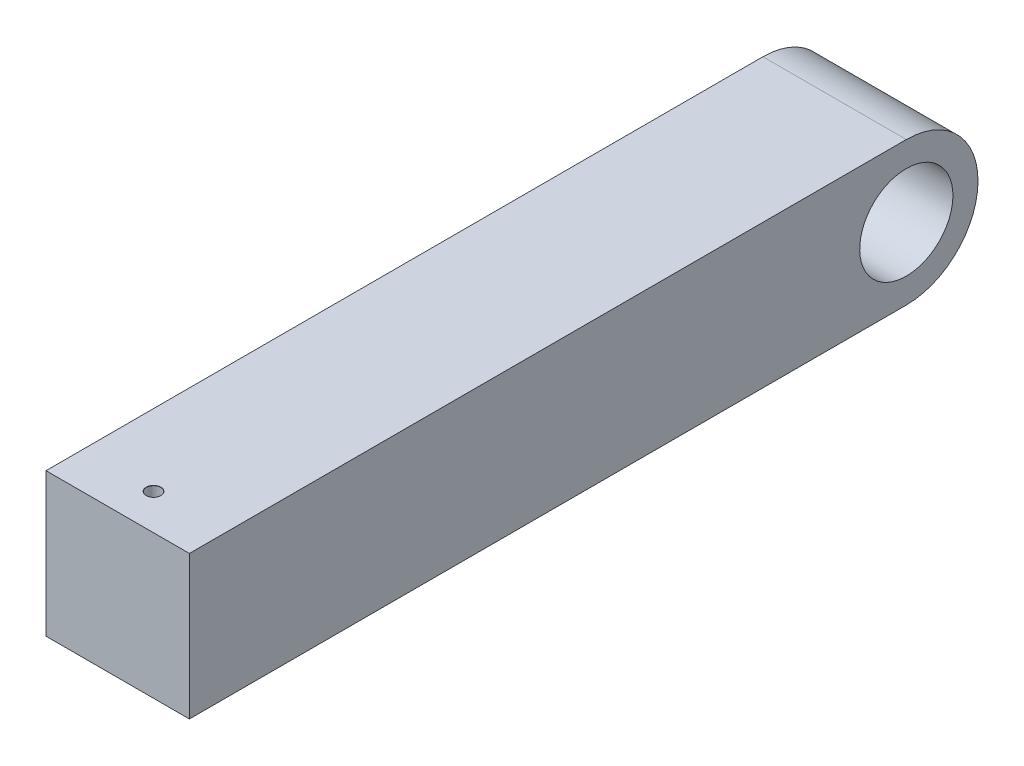
ISO-10303-21;
HEADER;
FILE_DESCRIPTION(('STEP AP214'),'2;1');
FILE_NAME('part.step','',(''),(''),'','','');
FILE_SCHEMA(('AUTOMOTIVE_DESIGN { 1 0 10303 214 1 1 1 1 }'));
ENDSEC;
DATA;
#1=APPLICATION_CONTEXT('core data for automotive mechanical design processes');
#2=APPLICATION_PROTOCOL_DEFINITION('international standard','automotive_design',2000,#1);
#3=PRODUCT_CONTEXT('',#1,'mechanical');
#4=PRODUCT('Part','Part','',(#3));
#5=PRODUCT_RELATED_PRODUCT_CATEGORY('part','',(#4));
#6=PRODUCT_DEFINITION_FORMATION('','',#4);
#7=PRODUCT_DEFINITION_CONTEXT('part definition',#1,'design');
#8=PRODUCT_DEFINITION('design','',#6,#7);
#9=PRODUCT_DEFINITION_SHAPE('','',#8);
#10=(LENGTH_UNIT() NAMED_UNIT(*) SI_UNIT(.MILLI.,.METRE.));
#11=(NAMED_UNIT(*) PLANE_ANGLE_UNIT() SI_UNIT($,.RADIAN.));
#12=(NAMED_UNIT(*) SI_UNIT($,.STERADIAN.) SOLID_ANGLE_UNIT());
#13=UNCERTAINTY_MEASURE_WITH_UNIT(LENGTH_MEASURE(1.E-05),#10,'distance_accuracy_value','');
#14=(GEOMETRIC_REPRESENTATION_CONTEXT(3) GLOBAL_UNCERTAINTY_ASSIGNED_CONTEXT((#13)) GLOBAL_UNIT_ASSIGNED_CONTEXT((#10,
#11,#12)) REPRESENTATION_CONTEXT('',''));
#15=CARTESIAN_POINT('',(0.,0.,0.));
#16=DIRECTION('',(0.,0.,1.));
#17=DIRECTION('',(1.,0.,0.));
#18=AXIS2_PLACEMENT_3D('',#15,#16,#17);
#19=CARTESIAN_POINT('',(-10.,-10.,-110.));
#20=DIRECTION('',(0.,-1.,0.));
#21=DIRECTION('',(0.,0.,-1.));
#22=AXIS2_PLACEMENT_3D('',#19,#20,#21);
#23=PLANE('',#22);
#24=CARTESIAN_POINT('',(0.,-10.,-5.));
#25=DIRECTION('',(0.,-1.,0.));
#26=DIRECTION('',(0.,0.,-1.));
#27=AXIS2_PLACEMENT_3D('',#24,#25,#26);
#28=CIRCLE('',#27,1.025);
#29=CARTESIAN_POINT('',(0.,-10.,-6.025));
#30=VERTEX_POINT('',#29);
#31=EDGE_CURVE('E184',#30,#30,#28,.T.);
#32=ORIENTED_EDGE('',*,*,#31,.F.);
#33=EDGE_LOOP('',(#32));
#34=FACE_BOUND('',#33,.T.);
#35=DIRECTION('',(0.,0.,1.));
#36=VECTOR('',#35,1.);
#37=CARTESIAN_POINT('',(-10.,-10.,-110.));
#38=LINE('',#37,#36);
#39=CARTESIAN_POINT('',(-10.,-10.,-100.));
#40=VERTEX_POINT('',#39);
#41=CARTESIAN_POINT('',(-10.,-10.,0.));
#42=VERTEX_POINT('',#41);
#43=EDGE_CURVE('E118',#40,#42,#38,.T.);
#44=ORIENTED_EDGE('',*,*,#43,.F.);
#45=DIRECTION('',(1.,0.,0.));
#46=VECTOR('',#45,1.);
#47=CARTESIAN_POINT('',(10.,-10.,-100.));
#48=LINE('',#47,#46);
#49=CARTESIAN_POINT('',(10.,-10.,-100.));
#50=VERTEX_POINT('',#49);
#51=EDGE_CURVE('E98',#40,#50,#48,.T.);
#52=ORIENTED_EDGE('',*,*,#51,.T.);
#53=DIRECTION('',(0.,0.,1.));
#54=VECTOR('',#53,1.);
#55=CARTESIAN_POINT('',(10.,-10.,-110.));
#56=LINE('',#55,#54);
#57=CARTESIAN_POINT('',(10.,-10.,0.));
#58=VERTEX_POINT('',#57);
#59=EDGE_CURVE('E86',#50,#58,#56,.T.);
#60=ORIENTED_EDGE('',*,*,#59,.T.);
#61=DIRECTION('',(1.,0.,0.));
#62=VECTOR('',#61,1.);
#63=CARTESIAN_POINT('',(-10.,-10.,0.));
#64=LINE('',#63,#62);
#65=EDGE_CURVE('E91',#42,#58,#64,.T.);
#66=ORIENTED_EDGE('',*,*,#65,.F.);
#67=EDGE_LOOP('',(#44,#52,#60,#66));
#68=FACE_BOUND('',#67,.T.);
#69=ADVANCED_FACE('F41',(#34,#68),#23,.T.);
#70=CARTESIAN_POINT('',(-10.,-10.,-110.));
#71=DIRECTION('',(-1.,0.,0.));
#72=DIRECTION('',(0.,-1.,0.));
#73=AXIS2_PLACEMENT_3D('',#70,#71,#72);
#74=PLANE('',#73);
#75=CARTESIAN_POINT('',(-10.,0.,-100.));
#76=DIRECTION('',(-1.,0.,0.));
#77=DIRECTION('',(0.,-1.,0.));
#78=AXIS2_PLACEMENT_3D('',#75,#76,#77);
#79=CIRCLE('',#78,6.5);
#80=CARTESIAN_POINT('',(-10.,6.5,-100.));
#81=VERTEX_POINT('',#80);
#82=EDGE_CURVE('E113',#81,#81,#79,.F.);
#83=ORIENTED_EDGE('',*,*,#82,.T.);
#84=EDGE_LOOP('',(#83));
#85=FACE_BOUND('',#84,.T.);
#86=CARTESIAN_POINT('',(-10.,0.,-100.));
#87=DIRECTION('',(-1.,0.,0.));
#88=DIRECTION('',(0.,-1.,0.));
#89=AXIS2_PLACEMENT_3D('',#86,#87,#88);
#90=CIRCLE('',#89,10.);
#91=CARTESIAN_POINT('',(-10.,10.,-100.));
#92=VERTEX_POINT('',#91);
#93=CARTESIAN_POINT('',(-10.,0.,-110.));
#94=VERTEX_POINT('',#93);
#95=EDGE_CURVE('E60',#92,#94,#90,.T.);
#96=ORIENTED_EDGE('',*,*,#95,.T.);
#97=CARTESIAN_POINT('',(-10.,0.,-100.));
#98=DIRECTION('',(-1.,0.,0.));
#99=DIRECTION('',(0.,-1.,0.));
#100=AXIS2_PLACEMENT_3D('',#97,#98,#99);
#101=CIRCLE('',#100,10.);
#102=EDGE_CURVE('E49',#94,#40,#101,.T.);
#103=ORIENTED_EDGE('',*,*,#102,.T.);
#104=ORIENTED_EDGE('',*,*,#43,.T.);
#105=DIRECTION('',(0.,-1.,0.));
#106=VECTOR('',#105,1.);
#107=CARTESIAN_POINT('',(-10.,-10.,0.));
#108=LINE('',#107,#106);
#109=CARTESIAN_POINT('',(-10.,10.,0.));
#110=VERTEX_POINT('',#109);
#111=EDGE_CURVE('E100',#110,#42,#108,.T.);
#112=ORIENTED_EDGE('',*,*,#111,.F.);
#113=DIRECTION('',(0.,0.,1.));
#114=VECTOR('',#113,1.);
#115=CARTESIAN_POINT('',(-10.,10.,-110.));
#116=LINE('',#115,#114);
#117=EDGE_CURVE('E122',#92,#110,#116,.T.);
#118=ORIENTED_EDGE('',*,*,#117,.F.);
#119=EDGE_LOOP('',(#96,#103,#104,#112,#118));
#120=FACE_BOUND('',#119,.T.);
#121=ADVANCED_FACE('F132',(#85,#120),#74,.T.);
#122=CARTESIAN_POINT('',(-10.,10.,-110.));
#123=DIRECTION('',(0.,1.,0.));
#124=DIRECTION('',(0.,0.,1.));
#125=AXIS2_PLACEMENT_3D('',#122,#123,#124);
#126=PLANE('',#125);
#127=CARTESIAN_POINT('',(0.,10.,-5.));
#128=DIRECTION('',(0.,1.,0.));
#129=DIRECTION('',(0.,0.,1.));
#130=AXIS2_PLACEMENT_3D('',#127,#128,#129);
#131=CIRCLE('',#130,1.025);
#132=CARTESIAN_POINT('',(0.,10.,-3.975));
#133=VERTEX_POINT('',#132);
#134=EDGE_CURVE('E182',#133,#133,#131,.T.);
#135=ORIENTED_EDGE('',*,*,#134,.F.);
#136=EDGE_LOOP('',(#135));
#137=FACE_BOUND('',#136,.T.);
#138=DIRECTION('',(0.,0.,1.));
#139=VECTOR('',#138,1.);
#140=CARTESIAN_POINT('',(10.,10.,-110.));
#141=LINE('',#140,#139);
#142=CARTESIAN_POINT('',(10.,10.,-100.));
#143=VERTEX_POINT('',#142);
#144=CARTESIAN_POINT('',(10.,10.,0.));
#145=VERTEX_POINT('',#144);
#146=EDGE_CURVE('E96',#143,#145,#141,.T.);
#147=ORIENTED_EDGE('',*,*,#146,.F.);
#148=DIRECTION('',(-1.,0.,0.));
#149=VECTOR('',#148,1.);
#150=CARTESIAN_POINT('',(-10.,10.,-100.));
#151=LINE('',#150,#149);
#152=EDGE_CURVE('E11',#143,#92,#151,.T.);
#153=ORIENTED_EDGE('',*,*,#152,.T.);
#154=ORIENTED_EDGE('',*,*,#117,.T.);
#155=DIRECTION('',(-1.,0.,0.));
#156=VECTOR('',#155,1.);
#157=CARTESIAN_POINT('',(-10.,10.,0.));
#158=LINE('',#157,#156);
#159=EDGE_CURVE('E110',#145,#110,#158,.T.);
#160=ORIENTED_EDGE('',*,*,#159,.F.);
#161=EDGE_LOOP('',(#147,#153,#154,#160));
#162=FACE_BOUND('',#161,.T.);
#163=ADVANCED_FACE('F152',(#137,#162),#126,.T.);
#164=CARTESIAN_POINT('',(10.,-10.,-110.));
#165=DIRECTION('',(1.,0.,0.));
#166=DIRECTION('',(0.,1.,0.));
#167=AXIS2_PLACEMENT_3D('',#164,#165,#166);
#168=PLANE('',#167);
#169=CARTESIAN_POINT('',(10.,0.,-100.));
#170=DIRECTION('',(1.,0.,0.));
#171=DIRECTION('',(0.,1.,0.));
#172=AXIS2_PLACEMENT_3D('',#169,#170,#171);
#173=CIRCLE('',#172,6.5);
#174=CARTESIAN_POINT('',(10.,6.5,-100.));
#175=VERTEX_POINT('',#174);
#176=EDGE_CURVE('E195',#175,#175,#173,.T.);
#177=ORIENTED_EDGE('',*,*,#176,.F.);
#178=EDGE_LOOP('',(#177));
#179=FACE_BOUND('',#178,.T.);
#180=ORIENTED_EDGE('',*,*,#59,.F.);
#181=CARTESIAN_POINT('',(10.,0.,-100.));
#182=DIRECTION('',(1.,0.,0.));
#183=DIRECTION('',(0.,1.,0.));
#184=AXIS2_PLACEMENT_3D('',#181,#182,#183);
#185=CIRCLE('',#184,10.);
#186=CARTESIAN_POINT('',(10.,0.,-110.));
#187=VERTEX_POINT('',#186);
#188=EDGE_CURVE('E130',#50,#187,#185,.T.);
#189=ORIENTED_EDGE('',*,*,#188,.T.);
#190=CARTESIAN_POINT('',(10.,0.,-100.));
#191=DIRECTION('',(1.,0.,0.));
#192=DIRECTION('',(0.,1.,0.));
#193=AXIS2_PLACEMENT_3D('',#190,#191,#192);
#194=CIRCLE('',#193,10.);
#195=EDGE_CURVE('E123',#187,#143,#194,.T.);
#196=ORIENTED_EDGE('',*,*,#195,.T.);
#197=ORIENTED_EDGE('',*,*,#146,.T.);
#198=DIRECTION('',(0.,1.,0.));
#199=VECTOR('',#198,1.);
#200=CARTESIAN_POINT('',(10.,-10.,0.));
#201=LINE('',#200,#199);
#202=EDGE_CURVE('E105',#58,#145,#201,.T.);
#203=ORIENTED_EDGE('',*,*,#202,.F.);
#204=EDGE_LOOP('',(#180,#189,#196,#197,#203));
#205=FACE_BOUND('',#204,.T.);
#206=ADVANCED_FACE('F101',(#179,#205),#168,.T.);
#207=CARTESIAN_POINT('',(0.,0.,0.));
#208=DIRECTION('',(0.,0.,1.));
#209=DIRECTION('',(1.,0.,0.));
#210=AXIS2_PLACEMENT_3D('',#207,#208,#209);
#211=PLANE('',#210);
#212=ORIENTED_EDGE('',*,*,#65,.T.);
#213=ORIENTED_EDGE('',*,*,#202,.T.);
#214=ORIENTED_EDGE('',*,*,#159,.T.);
#215=ORIENTED_EDGE('',*,*,#111,.T.);
#216=EDGE_LOOP('',(#212,#213,#214,#215));
#217=FACE_BOUND('',#216,.T.);
#218=ADVANCED_FACE('F107',(#217),#211,.T.);
#219=CARTESIAN_POINT('',(-10.,0.,-100.));
#220=DIRECTION('',(1.,0.,0.));
#221=DIRECTION('',(0.,0.,-1.));
#222=AXIS2_PLACEMENT_3D('',#219,#220,#221);
#223=CYLINDRICAL_SURFACE('',#222,10.);
#224=DIRECTION('',(-1.,0.,0.));
#225=VECTOR('',#224,1.);
#226=CARTESIAN_POINT('',(10.,0.,-110.));
#227=LINE('',#226,#225);
#228=EDGE_CURVE('E44',#94,#187,#227,.F.);
#229=ORIENTED_EDGE('',*,*,#228,.F.);
#230=ORIENTED_EDGE('',*,*,#95,.F.);
#231=ORIENTED_EDGE('',*,*,#152,.F.);
#232=ORIENTED_EDGE('',*,*,#195,.F.);
#233=EDGE_LOOP('',(#229,#230,#231,#232));
#234=FACE_BOUND('',#233,.T.);
#235=ADVANCED_FACE('F43',(#234),#223,.T.);
#236=CARTESIAN_POINT('',(-10.,0.,-100.));
#237=DIRECTION('',(-1.,0.,0.));
#238=DIRECTION('',(0.,0.,1.));
#239=AXIS2_PLACEMENT_3D('',#236,#237,#238);
#240=CYLINDRICAL_SURFACE('',#239,10.);
#241=ORIENTED_EDGE('',*,*,#102,.F.);
#242=ORIENTED_EDGE('',*,*,#228,.T.);
#243=ORIENTED_EDGE('',*,*,#188,.F.);
#244=ORIENTED_EDGE('',*,*,#51,.F.);
#245=EDGE_LOOP('',(#241,#242,#243,#244));
#246=FACE_BOUND('',#245,.T.);
#247=ADVANCED_FACE('F134',(#246),#240,.T.);
#248=CARTESIAN_POINT('',(-28.3847763108503,0.,-100.));
#249=DIRECTION('',(1.,0.,0.));
#250=DIRECTION('',(0.,1.,0.));
#251=AXIS2_PLACEMENT_3D('',#248,#249,#250);
#252=CYLINDRICAL_SURFACE('',#251,6.5);
#253=CARTESIAN_POINT('',(10.,6.5,-100.));
#254=CARTESIAN_POINT('',(9.79166666666668,6.5,-100.));
#255=CARTESIAN_POINT('',(9.58333333333334,6.5,-100.));
#256=CARTESIAN_POINT('',(9.16666666666667,6.5,-100.));
#257=CARTESIAN_POINT('',(8.95833333333334,6.5,-100.));
#258=CARTESIAN_POINT('',(8.54166666666667,6.5,-100.));
#259=CARTESIAN_POINT('',(8.33333333333334,6.5,-100.));
#260=CARTESIAN_POINT('',(7.91666666666667,6.5,-100.));
#261=CARTESIAN_POINT('',(7.70833333333334,6.5,-100.));
#262=CARTESIAN_POINT('',(7.29166666666667,6.5,-100.));
#263=CARTESIAN_POINT('',(7.08333333333334,6.5,-100.));
#264=CARTESIAN_POINT('',(6.66666666666667,6.5,-100.));
#265=CARTESIAN_POINT('',(6.45833333333334,6.5,-100.));
#266=CARTESIAN_POINT('',(6.04166666666667,6.5,-100.));
#267=CARTESIAN_POINT('',(5.83333333333334,6.5,-100.));
#268=CARTESIAN_POINT('',(5.41666666666667,6.5,-100.));
#269=CARTESIAN_POINT('',(5.20833333333334,6.5,-100.));
#270=CARTESIAN_POINT('',(4.79166666666667,6.5,-100.));
#271=CARTESIAN_POINT('',(4.58333333333334,6.5,-100.));
#272=CARTESIAN_POINT('',(4.16666666666667,6.5,-100.));
#273=CARTESIAN_POINT('',(3.95833333333334,6.5,-100.));
#274=CARTESIAN_POINT('',(3.54166666666667,6.5,-100.));
#275=CARTESIAN_POINT('',(3.33333333333334,6.5,-100.));
#276=CARTESIAN_POINT('',(2.91666666666667,6.5,-100.));
#277=CARTESIAN_POINT('',(2.70833333333334,6.5,-100.));
#278=CARTESIAN_POINT('',(2.29166666666667,6.5,-100.));
#279=CARTESIAN_POINT('',(2.08333333333334,6.5,-100.));
#280=CARTESIAN_POINT('',(1.66666666666667,6.5,-100.));
#281=CARTESIAN_POINT('',(1.45833333333334,6.5,-100.));
#282=CARTESIAN_POINT('',(1.04166666666667,6.5,-100.));
#283=CARTESIAN_POINT('',(0.833333333333337,6.5,-100.));
#284=CARTESIAN_POINT('',(0.416666666666671,6.5,-100.));
#285=CARTESIAN_POINT('',(0.208333333333337,6.5,-100.));
#286=CARTESIAN_POINT('',(-0.20833333333333,6.5,-100.));
#287=CARTESIAN_POINT('',(-0.416666666666664,6.5,-100.));
#288=CARTESIAN_POINT('',(-0.833333333333331,6.5,-100.));
#289=CARTESIAN_POINT('',(-1.04166666666666,6.5,-100.));
#290=CARTESIAN_POINT('',(-1.45833333333333,6.5,-100.));
#291=CARTESIAN_POINT('',(-1.66666666666666,6.5,-100.));
#292=CARTESIAN_POINT('',(-2.08333333333333,6.5,-100.));
#293=CARTESIAN_POINT('',(-2.29166666666667,6.5,-100.));
#294=CARTESIAN_POINT('',(-2.70833333333333,6.5,-100.));
#295=CARTESIAN_POINT('',(-2.91666666666667,6.5,-100.));
#296=CARTESIAN_POINT('',(-3.33333333333333,6.5,-100.));
#297=CARTESIAN_POINT('',(-3.54166666666667,6.5,-100.));
#298=CARTESIAN_POINT('',(-3.95833333333333,6.5,-100.));
#299=CARTESIAN_POINT('',(-4.16666666666667,6.5,-100.));
#300=CARTESIAN_POINT('',(-4.58333333333333,6.5,-100.));
#301=CARTESIAN_POINT('',(-4.79166666666667,6.5,-100.));
#302=CARTESIAN_POINT('',(-5.20833333333333,6.5,-100.));
#303=CARTESIAN_POINT('',(-5.41666666666667,6.5,-100.));
#304=CARTESIAN_POINT('',(-5.83333333333334,6.5,-100.));
#305=CARTESIAN_POINT('',(-6.04166666666667,6.5,-100.));
#306=CARTESIAN_POINT('',(-6.45833333333334,6.5,-100.));
#307=CARTESIAN_POINT('',(-6.66666666666667,6.5,-100.));
#308=CARTESIAN_POINT('',(-7.08333333333334,6.5,-100.));
#309=CARTESIAN_POINT('',(-7.29166666666667,6.5,-100.));
#310=CARTESIAN_POINT('',(-7.70833333333334,6.5,-100.));
#311=CARTESIAN_POINT('',(-7.91666666666667,6.5,-100.));
#312=CARTESIAN_POINT('',(-8.33333333333334,6.5,-100.));
#313=CARTESIAN_POINT('',(-8.54166666666667,6.5,-100.));
#314=CARTESIAN_POINT('',(-8.95833333333334,6.5,-100.));
#315=CARTESIAN_POINT('',(-9.16666666666667,6.5,-100.));
#316=CARTESIAN_POINT('',(-9.58333333333334,6.5,-100.));
#317=CARTESIAN_POINT('',(-9.79166666666667,6.5,-100.));
#318=CARTESIAN_POINT('',(-10.,6.5,-100.));
#319=B_SPLINE_CURVE_WITH_KNOTS('',3,(#253,#254,#255,#256,#257,#258,#259,#260,#261,#262,#263,
#264,#265,#266,#267,#268,#269,#270,#271,#272,#273,#274,#275,#276,#277,#278,#279,#280,#281,#282,
#283,#284,#285,#286,#287,#288,#289,#290,#291,#292,#293,#294,#295,#296,#297,#298,#299,#300,#301,
#302,#303,#304,#305,#306,#307,#308,#309,#310,#311,#312,#313,#314,#315,#316,#317,#318),
.UNSPECIFIED.,.F.,.F.,(4,2,2,2,2,2,2,2,2,2,2,2,2,2,2,2,2,2,2,2,2,2,2,2,2,2,2,2,2,2,2,2,4),(0.,
0.625000000000001,1.25,1.875,2.5,3.125,3.75,4.375,5.,5.62500000000001,6.25000000000001,
6.87500000000001,7.5,8.125,8.75,9.37500000000001,10.,10.625,11.25,11.875,12.5,13.125,13.75,
14.375,15.,15.625,16.25,16.875,17.5,18.125,18.75,19.375,20.),.UNSPECIFIED.);
#320=EDGE_CURVE('BSEAM142',#175,#81,#319,.T.);
#321=ORIENTED_EDGE('',*,*,#176,.T.);
#322=ORIENTED_EDGE('',*,*,#82,.F.);
#323=ORIENTED_EDGE('',*,*,#320,.T.);
#324=ORIENTED_EDGE('',*,*,#320,.F.);
#325=EDGE_LOOP('',(#321,#323,#322,#324));
#326=FACE_BOUND('',#325,.T.);
#327=ADVANCED_FACE('F142',(#326),#252,.F.);
#328=CARTESIAN_POINT('',(0.,-10.,-5.));
#329=DIRECTION('',(0.,-1.,0.));
#330=DIRECTION('',(0.,0.,-1.));
#331=AXIS2_PLACEMENT_3D('',#328,#329,#330);
#332=CYLINDRICAL_SURFACE('',#331,0.999999999999998);
#333=CARTESIAN_POINT('',(0.,9.975,-5.));
#334=DIRECTION('',(0.,1.,0.));
#335=DIRECTION('',(0.,0.,1.));
#336=AXIS2_PLACEMENT_3D('',#333,#334,#335);
#337=CIRCLE('',#336,0.999999999999999);
#338=CARTESIAN_POINT('',(0.,9.975,-4.));
#339=VERTEX_POINT('',#338);
#340=EDGE_CURVE('E179',#339,#339,#337,.T.);
#341=ORIENTED_EDGE('',*,*,#340,.T.);
#342=EDGE_LOOP('',(#341));
#343=FACE_BOUND('',#342,.T.);
#344=CARTESIAN_POINT('',(0.,-9.975,-5.));
#345=DIRECTION('',(0.,-1.,0.));
#346=DIRECTION('',(0.,0.,-1.));
#347=AXIS2_PLACEMENT_3D('',#344,#345,#346);
#348=CIRCLE('',#347,0.999999999999999);
#349=CARTESIAN_POINT('',(0.,-9.975,-6.));
#350=VERTEX_POINT('',#349);
#351=EDGE_CURVE('E188',#350,#350,#348,.T.);
#352=ORIENTED_EDGE('',*,*,#351,.T.);
#353=EDGE_LOOP('',(#352));
#354=FACE_BOUND('',#353,.T.);
#355=ADVANCED_FACE('F161',(#343,#354),#332,.F.);
#356=CARTESIAN_POINT('',(0.,-10.,-5.));
#357=DIRECTION('',(0.,-1.,0.));
#358=DIRECTION('',(0.,0.,-1.));
#359=AXIS2_PLACEMENT_3D('',#356,#357,#358);
#360=CONICAL_SURFACE('',#359,1.025,0.785398163397444);
#361=ORIENTED_EDGE('',*,*,#351,.F.);
#362=EDGE_LOOP('',(#361));
#363=FACE_BOUND('',#362,.T.);
#364=ORIENTED_EDGE('',*,*,#31,.T.);
#365=EDGE_LOOP('',(#364));
#366=FACE_BOUND('',#365,.T.);
#367=ADVANCED_FACE('F170',(#363,#366),#360,.F.);
#368=CARTESIAN_POINT('',(0.,10.,-5.));
#369=DIRECTION('',(0.,1.,0.));
#370=DIRECTION('',(0.,0.,1.));
#371=AXIS2_PLACEMENT_3D('',#368,#369,#370);
#372=CONICAL_SURFACE('',#371,1.025,0.785398163397444);
#373=ORIENTED_EDGE('',*,*,#340,.F.);
#374=EDGE_LOOP('',(#373));
#375=FACE_BOUND('',#374,.T.);
#376=ORIENTED_EDGE('',*,*,#134,.T.);
#377=EDGE_LOOP('',(#376));
#378=FACE_BOUND('',#377,.T.);
#379=ADVANCED_FACE('F167',(#375,#378),#372,.F.);
#380=CLOSED_SHELL('',(#69,#121,#163,#206,#218,#235,#247,#327,#355,#367,#379));
#381=MANIFOLD_SOLID_BREP('B2',#380);
#382=ADVANCED_BREP_SHAPE_REPRESENTATION('',(#18,#381),#14);
#383=SHAPE_DEFINITION_REPRESENTATION(#9,#382);
ENDSEC;
END-ISO-10303-21;
